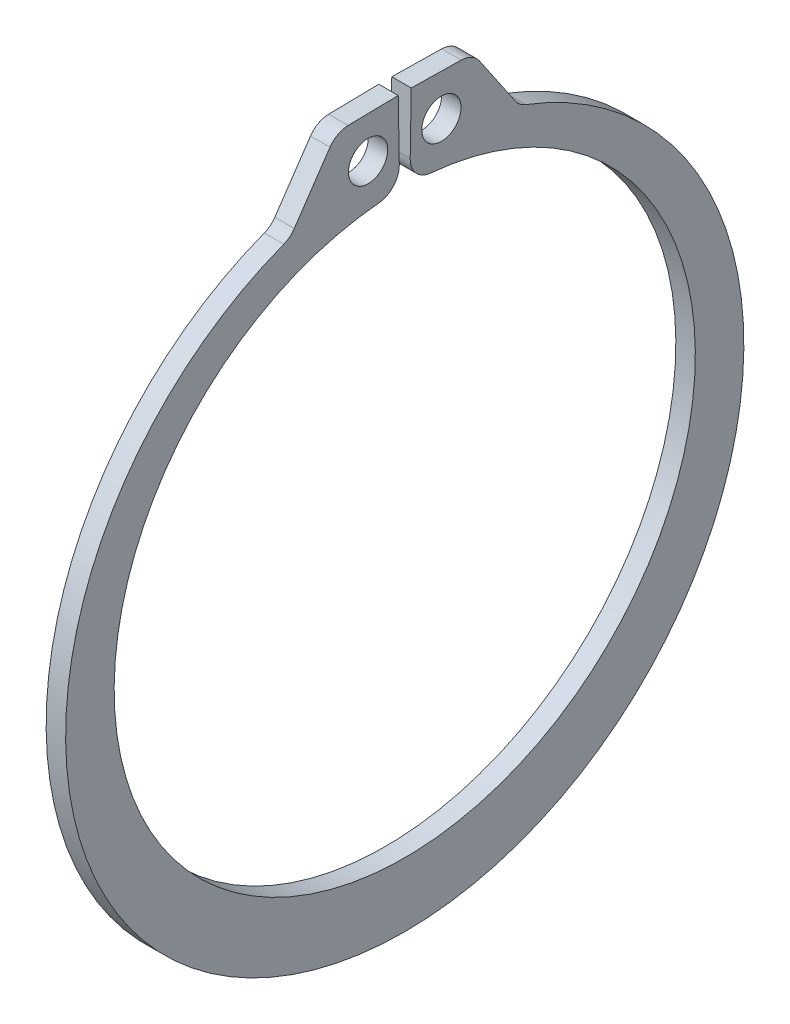
ISO-10303-21;
HEADER;
FILE_DESCRIPTION(('STEP AP214'),'2;1');
FILE_NAME('part.step','',(''),(''),'','','');
FILE_SCHEMA(('AUTOMOTIVE_DESIGN { 1 0 10303 214 1 1 1 1 }'));
ENDSEC;
DATA;
#1=APPLICATION_CONTEXT('core data for automotive mechanical design processes');
#2=APPLICATION_PROTOCOL_DEFINITION('international standard','automotive_design',2000,#1);
#3=PRODUCT_CONTEXT('',#1,'mechanical');
#4=PRODUCT('Part','Part','',(#3));
#5=PRODUCT_RELATED_PRODUCT_CATEGORY('part','',(#4));
#6=PRODUCT_DEFINITION_FORMATION('','',#4);
#7=PRODUCT_DEFINITION_CONTEXT('part definition',#1,'design');
#8=PRODUCT_DEFINITION('design','',#6,#7);
#9=PRODUCT_DEFINITION_SHAPE('','',#8);
#10=(LENGTH_UNIT() NAMED_UNIT(*) SI_UNIT(.MILLI.,.METRE.));
#11=(NAMED_UNIT(*) PLANE_ANGLE_UNIT() SI_UNIT($,.RADIAN.));
#12=(NAMED_UNIT(*) SI_UNIT($,.STERADIAN.) SOLID_ANGLE_UNIT());
#13=UNCERTAINTY_MEASURE_WITH_UNIT(LENGTH_MEASURE(1.E-05),#10,'distance_accuracy_value','');
#14=(GEOMETRIC_REPRESENTATION_CONTEXT(3) GLOBAL_UNCERTAINTY_ASSIGNED_CONTEXT((#13)) GLOBAL_UNIT_ASSIGNED_CONTEXT((#10,
#11,#12)) REPRESENTATION_CONTEXT('',''));
#15=CARTESIAN_POINT('',(0.,0.,0.));
#16=DIRECTION('',(0.,0.,1.));
#17=DIRECTION('',(1.,0.,0.));
#18=AXIS2_PLACEMENT_3D('',#15,#16,#17);
#19=CARTESIAN_POINT('',(0.7874,-1.25782092988819,0.));
#20=DIRECTION('',(1.,0.,0.));
#21=DIRECTION('',(0.,0.,-1.));
#22=AXIS2_PLACEMENT_3D('',#19,#20,#21);
#23=PLANE('',#22);
#24=CARTESIAN_POINT('',(0.7874,26.7747614656782,2.96328534207093));
#25=DIRECTION('',(1.,0.,0.));
#26=DIRECTION('',(0.,0.,-1.));
#27=AXIS2_PLACEMENT_3D('',#24,#25,#26);
#28=CIRCLE('',#27,1.5875);
#29=CARTESIAN_POINT('',(0.7874,26.7747614656782,1.37578534207093));
#30=VERTEX_POINT('',#29);
#31=EDGE_CURVE('E178',#30,#30,#28,.T.);
#32=ORIENTED_EDGE('',*,*,#31,.F.);
#33=EDGE_LOOP('',(#32));
#34=FACE_BOUND('',#33,.T.);
#35=DIRECTION('',(0.,0.827378750323037,0.561644374594716));
#36=VECTOR('',#35,1.);
#37=CARTESIAN_POINT('',(0.7874,30.058101333657,-5.51652639489787));
#38=LINE('',#37,#36);
#39=CARTESIAN_POINT('',(0.7874,25.0331530848591,-8.92758078258311));
#40=VERTEX_POINT('',#39);
#41=CARTESIAN_POINT('',(0.7874,29.2787202455527,-6.0455888147732));
#42=VERTEX_POINT('',#41);
#43=EDGE_CURVE('E184',#40,#42,#38,.T.);
#44=ORIENTED_EDGE('',*,*,#43,.T.);
#45=CARTESIAN_POINT('',(0.7874,28.2587178968512,-4.54298626631154));
#46=DIRECTION('',(1.,0.,0.));
#47=DIRECTION('',(0.,0.,-1.));
#48=AXIS2_PLACEMENT_3D('',#45,#46,#47);
#49=CIRCLE('',#48,1.8161);
#50=CARTESIAN_POINT('',(0.7874,30.0745412960247,-4.57468158164229));
#51=VERTEX_POINT('',#50);
#52=EDGE_CURVE('E223',#42,#51,#49,.T.);
#53=ORIENTED_EDGE('',*,*,#52,.T.);
#54=DIRECTION('',(0.,0.0174524064372831,0.999847695156391));
#55=VECTOR('',#54,1.);
#56=CARTESIAN_POINT('',(0.7874,30.1452080394262,-0.52618656360281));
#57=LINE('',#56,#55);
#58=CARTESIAN_POINT('',(0.7874,30.1452080394262,-0.52618656360281));
#59=VERTEX_POINT('',#58);
#60=EDGE_CURVE('E187',#51,#59,#57,.T.);
#61=ORIENTED_EDGE('',*,*,#60,.T.);
#62=DIRECTION('',(0.,-0.999847695156391,0.0174524064372839));
#63=VECTOR('',#62,1.);
#64=CARTESIAN_POINT('',(0.7874,23.4914215976994,-0.410044289243973));
#65=LINE('',#64,#63);
#66=CARTESIAN_POINT('',(0.7874,25.2420172473351,-0.44060104997142));
#67=VERTEX_POINT('',#66);
#68=EDGE_CURVE('E155',#59,#67,#65,.T.);
#69=ORIENTED_EDGE('',*,*,#68,.T.);
#70=CARTESIAN_POINT('',(0.7874,25.2103219320044,-2.25642444914494));
#71=DIRECTION('',(1.,0.,0.));
#72=DIRECTION('',(0.,0.,-1.));
#73=AXIS2_PLACEMENT_3D('',#70,#71,#72);
#74=CIRCLE('',#73,1.8161);
#75=CARTESIAN_POINT('',(0.7874,23.4014528721566,-2.09452344752541));
#76=VERTEX_POINT('',#75);
#77=EDGE_CURVE('E221',#67,#76,#74,.T.);
#78=ORIENTED_EDGE('',*,*,#77,.T.);
#79=CARTESIAN_POINT('',(0.7874,0.,0.));
#80=DIRECTION('',(-1.,0.,0.));
#81=DIRECTION('',(0.,0.,-1.));
#82=AXIS2_PLACEMENT_3D('',#79,#80,#81);
#83=CIRCLE('',#82,23.495);
#84=CARTESIAN_POINT('',(0.7874,23.4014528721566,2.09452344752541));
#85=VERTEX_POINT('',#84);
#86=EDGE_CURVE('E190',#76,#85,#83,.T.);
#87=ORIENTED_EDGE('',*,*,#86,.T.);
#88=CARTESIAN_POINT('',(0.7874,25.2103219320044,2.25642444914495));
#89=DIRECTION('',(1.,0.,0.));
#90=DIRECTION('',(0.,0.,-1.));
#91=AXIS2_PLACEMENT_3D('',#88,#89,#90);
#92=CIRCLE('',#91,1.8161);
#93=CARTESIAN_POINT('',(0.7874,25.2420172473351,0.440601049971422));
#94=VERTEX_POINT('',#93);
#95=EDGE_CURVE('E219',#85,#94,#92,.T.);
#96=ORIENTED_EDGE('',*,*,#95,.T.);
#97=DIRECTION('',(0.,0.999847695156391,0.0174524064372836));
#98=VECTOR('',#97,1.);
#99=CARTESIAN_POINT('',(0.7874,23.4914215976994,0.410044289243975));
#100=LINE('',#99,#98);
#101=CARTESIAN_POINT('',(0.7874,30.1452080394262,0.52618656360281));
#102=VERTEX_POINT('',#101);
#103=EDGE_CURVE('E193',#94,#102,#100,.T.);
#104=ORIENTED_EDGE('',*,*,#103,.T.);
#105=DIRECTION('',(0.,-0.0174524064372831,0.999847695156391));
#106=VECTOR('',#105,1.);
#107=CARTESIAN_POINT('',(0.7874,30.1452080394262,0.52618656360281));
#108=LINE('',#107,#106);
#109=CARTESIAN_POINT('',(0.7874,30.0745412960247,4.57468158164229));
#110=VERTEX_POINT('',#109);
#111=EDGE_CURVE('E195',#102,#110,#108,.T.);
#112=ORIENTED_EDGE('',*,*,#111,.T.);
#113=CARTESIAN_POINT('',(0.7874,28.2587178968512,4.54298626631154));
#114=DIRECTION('',(1.,0.,0.));
#115=DIRECTION('',(0.,0.,-1.));
#116=AXIS2_PLACEMENT_3D('',#113,#114,#115);
#117=CIRCLE('',#116,1.8161);
#118=CARTESIAN_POINT('',(0.7874,29.2787202455527,6.0455888147732));
#119=VERTEX_POINT('',#118);
#120=EDGE_CURVE('E56',#110,#119,#117,.T.);
#121=ORIENTED_EDGE('',*,*,#120,.T.);
#122=DIRECTION('',(0.,-0.827378750323037,0.561644374594716));
#123=VECTOR('',#122,1.);
#124=CARTESIAN_POINT('',(0.7874,30.058101333657,5.51652639489787));
#125=LINE('',#124,#123);
#126=CARTESIAN_POINT('',(0.7874,25.0331530848591,8.92758078258311));
#127=VERTEX_POINT('',#126);
#128=EDGE_CURVE('E197',#119,#127,#125,.T.);
#129=ORIENTED_EDGE('',*,*,#128,.T.);
#130=CARTESIAN_POINT('',(0.7874,26.0531554335606,10.4301833310448));
#131=DIRECTION('',(1.,0.,0.));
#132=DIRECTION('',(0.,0.,-1.));
#133=AXIS2_PLACEMENT_3D('',#130,#131,#132);
#134=CIRCLE('',#133,1.8161);
#135=CARTESIAN_POINT('',(0.7874,24.3565701986872,9.78224988476362));
#136=VERTEX_POINT('',#135);
#137=EDGE_CURVE('E11',#127,#136,#134,.F.);
#138=ORIENTED_EDGE('',*,*,#137,.T.);
#139=CARTESIAN_POINT('',(0.7874,-1.25782092988819,0.));
#140=DIRECTION('',(1.,0.,0.));
#141=DIRECTION('',(0.,0.,-1.));
#142=AXIS2_PLACEMENT_3D('',#139,#140,#141);
#143=CIRCLE('',#142,27.4187790701118);
#144=CARTESIAN_POINT('',(0.7874,24.3565701986872,-9.78224988476362));
#145=VERTEX_POINT('',#144);
#146=EDGE_CURVE('E181',#136,#145,#143,.T.);
#147=ORIENTED_EDGE('',*,*,#146,.T.);
#148=CARTESIAN_POINT('',(0.7874,26.0531554335606,-10.4301833310448));
#149=DIRECTION('',(1.,0.,0.));
#150=DIRECTION('',(0.,0.,-1.));
#151=AXIS2_PLACEMENT_3D('',#148,#149,#150);
#152=CIRCLE('',#151,1.8161);
#153=EDGE_CURVE('E243',#145,#40,#152,.F.);
#154=ORIENTED_EDGE('',*,*,#153,.T.);
#155=EDGE_LOOP('',(#44,#53,#61,#69,#78,#87,#96,#104,#112,#121,#129,#138,#147,#154));
#156=FACE_BOUND('',#155,.T.);
#157=CARTESIAN_POINT('',(0.7874,26.7747614656782,-2.96328534207093));
#158=DIRECTION('',(1.,0.,0.));
#159=DIRECTION('',(0.,0.,-1.));
#160=AXIS2_PLACEMENT_3D('',#157,#158,#159);
#161=CIRCLE('',#160,1.5875);
#162=CARTESIAN_POINT('',(0.7874,26.7747614656782,-4.55078534207093));
#163=VERTEX_POINT('',#162);
#164=EDGE_CURVE('E175',#163,#163,#161,.T.);
#165=ORIENTED_EDGE('',*,*,#164,.F.);
#166=EDGE_LOOP('',(#165));
#167=FACE_BOUND('',#166,.T.);
#168=ADVANCED_FACE('F34',(#34,#156,#167),#23,.T.);
#169=CARTESIAN_POINT('',(0.7874,-1.25782092988819,0.));
#170=DIRECTION('',(-1.,0.,0.));
#171=DIRECTION('',(0.,0.,1.));
#172=AXIS2_PLACEMENT_3D('',#169,#170,#171);
#173=CYLINDRICAL_SURFACE('',#172,27.4187790701118);
#174=CARTESIAN_POINT('',(-0.7874,-1.25782092988819,0.));
#175=DIRECTION('',(1.,0.,0.));
#176=DIRECTION('',(0.,0.,-1.));
#177=AXIS2_PLACEMENT_3D('',#174,#175,#176);
#178=CIRCLE('',#177,27.4187790701118);
#179=CARTESIAN_POINT('',(-0.7874,24.3565701986872,9.78224988476362));
#180=VERTEX_POINT('',#179);
#181=CARTESIAN_POINT('',(-0.7874,24.3565701986872,-9.78224988476362));
#182=VERTEX_POINT('',#181);
#183=EDGE_CURVE('E247',#180,#182,#178,.T.);
#184=ORIENTED_EDGE('',*,*,#183,.T.);
#185=DIRECTION('',(-1.,0.,0.));
#186=VECTOR('',#185,1.);
#187=CARTESIAN_POINT('',(0.7874,24.3565701986872,-9.78224988476362));
#188=LINE('',#187,#186);
#189=EDGE_CURVE('E208',#182,#145,#188,.F.);
#190=ORIENTED_EDGE('',*,*,#189,.T.);
#191=ORIENTED_EDGE('',*,*,#146,.F.);
#192=DIRECTION('',(-1.,0.,0.));
#193=VECTOR('',#192,1.);
#194=CARTESIAN_POINT('',(0.7874,24.3565701986872,9.78224988476363));
#195=LINE('',#194,#193);
#196=EDGE_CURVE('E205',#136,#180,#195,.T.);
#197=ORIENTED_EDGE('',*,*,#196,.T.);
#198=EDGE_LOOP('',(#184,#190,#191,#197));
#199=FACE_BOUND('',#198,.T.);
#200=ADVANCED_FACE('F257',(#199),#173,.T.);
#201=CARTESIAN_POINT('',(0.7874,30.058101333657,-5.51652639489787));
#202=DIRECTION('',(0.,-0.561644374594716,0.827378750323037));
#203=DIRECTION('',(0.,-0.827378750323037,-0.561644374594716));
#204=AXIS2_PLACEMENT_3D('',#201,#202,#203);
#205=PLANE('',#204);
#206=ORIENTED_EDGE('',*,*,#43,.F.);
#207=DIRECTION('',(1.,0.,0.));
#208=VECTOR('',#207,1.);
#209=CARTESIAN_POINT('',(-0.7874,25.0331530848591,-8.92758078258311));
#210=LINE('',#209,#208);
#211=CARTESIAN_POINT('',(-0.7874,25.0331530848591,-8.92758078258311));
#212=VERTEX_POINT('',#211);
#213=EDGE_CURVE('E202',#40,#212,#210,.F.);
#214=ORIENTED_EDGE('',*,*,#213,.T.);
#215=DIRECTION('',(0.,0.827378750323037,0.561644374594716));
#216=VECTOR('',#215,1.);
#217=CARTESIAN_POINT('',(-0.7874,30.058101333657,-5.51652639489787));
#218=LINE('',#217,#216);
#219=CARTESIAN_POINT('',(-0.7874,29.2787202455527,-6.0455888147732));
#220=VERTEX_POINT('',#219);
#221=EDGE_CURVE('E148',#212,#220,#218,.T.);
#222=ORIENTED_EDGE('',*,*,#221,.T.);
#223=DIRECTION('',(-1.,0.,0.));
#224=VECTOR('',#223,1.);
#225=CARTESIAN_POINT('',(0.7874,29.2787202455527,-6.0455888147732));
#226=LINE('',#225,#224);
#227=EDGE_CURVE('E156',#220,#42,#226,.F.);
#228=ORIENTED_EDGE('',*,*,#227,.T.);
#229=EDGE_LOOP('',(#206,#214,#222,#228));
#230=FACE_BOUND('',#229,.T.);
#231=ADVANCED_FACE('F265',(#230),#205,.F.);
#232=CARTESIAN_POINT('',(0.7874,30.1452080394262,-0.52618656360281));
#233=DIRECTION('',(0.,-0.999847695156391,0.0174524064372831));
#234=DIRECTION('',(0.,-0.0174524064372831,-0.999847695156391));
#235=AXIS2_PLACEMENT_3D('',#232,#233,#234);
#236=PLANE('',#235);
#237=ORIENTED_EDGE('',*,*,#60,.F.);
#238=DIRECTION('',(-1.,0.,0.));
#239=VECTOR('',#238,1.);
#240=CARTESIAN_POINT('',(0.7874,30.0745412960247,-4.57468158164229));
#241=LINE('',#240,#239);
#242=CARTESIAN_POINT('',(-0.7874,30.0745412960247,-4.57468158164229));
#243=VERTEX_POINT('',#242);
#244=EDGE_CURVE('E144',#51,#243,#241,.T.);
#245=ORIENTED_EDGE('',*,*,#244,.T.);
#246=DIRECTION('',(0.,0.0174524064372831,0.999847695156391));
#247=VECTOR('',#246,1.);
#248=CARTESIAN_POINT('',(-0.7874,30.1452080394262,-0.52618656360281));
#249=LINE('',#248,#247);
#250=CARTESIAN_POINT('',(-0.7874,30.1452080394262,-0.52618656360281));
#251=VERTEX_POINT('',#250);
#252=EDGE_CURVE('E137',#243,#251,#249,.T.);
#253=ORIENTED_EDGE('',*,*,#252,.T.);
#254=DIRECTION('',(-1.,0.,0.));
#255=VECTOR('',#254,1.);
#256=CARTESIAN_POINT('',(0.7874,30.1452080394262,-0.52618656360281));
#257=LINE('',#256,#255);
#258=EDGE_CURVE('E141',#59,#251,#257,.T.);
#259=ORIENTED_EDGE('',*,*,#258,.F.);
#260=EDGE_LOOP('',(#237,#245,#253,#259));
#261=FACE_BOUND('',#260,.T.);
#262=ADVANCED_FACE('F140',(#261),#236,.F.);
#263=CARTESIAN_POINT('',(0.7874,23.4914215976994,-0.410044289243973));
#264=DIRECTION('',(0.,-0.0174524064372839,-0.999847695156391));
#265=DIRECTION('',(0.,0.999847695156391,-0.0174524064372839));
#266=AXIS2_PLACEMENT_3D('',#263,#264,#265);
#267=PLANE('',#266);
#268=DIRECTION('',(0.,-0.999847695156391,0.0174524064372839));
#269=VECTOR('',#268,1.);
#270=CARTESIAN_POINT('',(-0.7874,23.4914215976994,-0.410044289243973));
#271=LINE('',#270,#269);
#272=CARTESIAN_POINT('',(-0.7874,25.2420172473351,-0.44060104997142));
#273=VERTEX_POINT('',#272);
#274=EDGE_CURVE('E147',#251,#273,#271,.T.);
#275=ORIENTED_EDGE('',*,*,#274,.T.);
#276=DIRECTION('',(-1.,0.,0.));
#277=VECTOR('',#276,1.);
#278=CARTESIAN_POINT('',(0.7874,25.2420172473351,-0.44060104997142));
#279=LINE('',#278,#277);
#280=EDGE_CURVE('E230',#273,#67,#279,.F.);
#281=ORIENTED_EDGE('',*,*,#280,.T.);
#282=ORIENTED_EDGE('',*,*,#68,.F.);
#283=ORIENTED_EDGE('',*,*,#258,.T.);
#284=EDGE_LOOP('',(#275,#281,#282,#283));
#285=FACE_BOUND('',#284,.T.);
#286=ADVANCED_FACE('F152',(#285),#267,.F.);
#287=CARTESIAN_POINT('',(0.7874,0.,0.));
#288=DIRECTION('',(-1.,0.,0.));
#289=DIRECTION('',(0.,0.,1.));
#290=AXIS2_PLACEMENT_3D('',#287,#288,#289);
#291=CYLINDRICAL_SURFACE('',#290,23.495);
#292=ORIENTED_EDGE('',*,*,#86,.F.);
#293=DIRECTION('',(-1.,0.,0.));
#294=VECTOR('',#293,1.);
#295=CARTESIAN_POINT('',(0.7874,23.4014528721566,-2.09452344752541));
#296=LINE('',#295,#294);
#297=CARTESIAN_POINT('',(-0.7874,23.4014528721566,-2.09452344752541));
#298=VERTEX_POINT('',#297);
#299=EDGE_CURVE('E227',#76,#298,#296,.T.);
#300=ORIENTED_EDGE('',*,*,#299,.T.);
#301=CARTESIAN_POINT('',(-0.7874,0.,0.));
#302=DIRECTION('',(-1.,0.,0.));
#303=DIRECTION('',(0.,0.,-1.));
#304=AXIS2_PLACEMENT_3D('',#301,#302,#303);
#305=CIRCLE('',#304,23.495);
#306=CARTESIAN_POINT('',(-0.7874,23.4014528721566,2.09452344752541));
#307=VERTEX_POINT('',#306);
#308=EDGE_CURVE('E162',#298,#307,#305,.T.);
#309=ORIENTED_EDGE('',*,*,#308,.T.);
#310=DIRECTION('',(-1.,0.,0.));
#311=VECTOR('',#310,1.);
#312=CARTESIAN_POINT('',(0.7874,23.4014528721566,2.09452344752541));
#313=LINE('',#312,#311);
#314=EDGE_CURVE('E225',#307,#85,#313,.F.);
#315=ORIENTED_EDGE('',*,*,#314,.T.);
#316=EDGE_LOOP('',(#292,#300,#309,#315));
#317=FACE_BOUND('',#316,.T.);
#318=ADVANCED_FACE('F277',(#317),#291,.F.);
#319=CARTESIAN_POINT('',(0.7874,23.4914215976994,0.410044289243975));
#320=DIRECTION('',(0.,-0.0174524064372836,0.999847695156391));
#321=DIRECTION('',(0.,-0.999847695156391,-0.0174524064372836));
#322=AXIS2_PLACEMENT_3D('',#319,#320,#321);
#323=PLANE('',#322);
#324=ORIENTED_EDGE('',*,*,#103,.F.);
#325=DIRECTION('',(-1.,0.,0.));
#326=VECTOR('',#325,1.);
#327=CARTESIAN_POINT('',(0.7874,25.2420172473351,0.440601049971422));
#328=LINE('',#327,#326);
#329=CARTESIAN_POINT('',(-0.7874,25.2420172473351,0.440601049971422));
#330=VERTEX_POINT('',#329);
#331=EDGE_CURVE('E232',#94,#330,#328,.T.);
#332=ORIENTED_EDGE('',*,*,#331,.T.);
#333=DIRECTION('',(0.,0.999847695156391,0.0174524064372836));
#334=VECTOR('',#333,1.);
#335=CARTESIAN_POINT('',(-0.7874,23.4914215976994,0.410044289243975));
#336=LINE('',#335,#334);
#337=CARTESIAN_POINT('',(-0.7874,30.1452080394262,0.52618656360281));
#338=VERTEX_POINT('',#337);
#339=EDGE_CURVE('E165',#330,#338,#336,.T.);
#340=ORIENTED_EDGE('',*,*,#339,.T.);
#341=DIRECTION('',(-1.,0.,0.));
#342=VECTOR('',#341,1.);
#343=CARTESIAN_POINT('',(0.7874,30.1452080394262,0.52618656360281));
#344=LINE('',#343,#342);
#345=EDGE_CURVE('E157',#102,#338,#344,.T.);
#346=ORIENTED_EDGE('',*,*,#345,.F.);
#347=EDGE_LOOP('',(#324,#332,#340,#346));
#348=FACE_BOUND('',#347,.T.);
#349=ADVANCED_FACE('F287',(#348),#323,.F.);
#350=CARTESIAN_POINT('',(0.7874,30.1452080394262,0.52618656360281));
#351=DIRECTION('',(0.,-0.999847695156391,-0.0174524064372831));
#352=DIRECTION('',(0.,0.0174524064372831,-0.999847695156391));
#353=AXIS2_PLACEMENT_3D('',#350,#351,#352);
#354=PLANE('',#353);
#355=DIRECTION('',(0.,-0.0174524064372831,0.999847695156391));
#356=VECTOR('',#355,1.);
#357=CARTESIAN_POINT('',(-0.7874,30.1452080394262,0.52618656360281));
#358=LINE('',#357,#356);
#359=CARTESIAN_POINT('',(-0.7874,30.0745412960247,4.57468158164229));
#360=VERTEX_POINT('',#359);
#361=EDGE_CURVE('E170',#338,#360,#358,.T.);
#362=ORIENTED_EDGE('',*,*,#361,.T.);
#363=DIRECTION('',(-1.,0.,0.));
#364=VECTOR('',#363,1.);
#365=CARTESIAN_POINT('',(0.7874,30.0745412960247,4.57468158164229));
#366=LINE('',#365,#364);
#367=EDGE_CURVE('E239',#360,#110,#366,.F.);
#368=ORIENTED_EDGE('',*,*,#367,.T.);
#369=ORIENTED_EDGE('',*,*,#111,.F.);
#370=ORIENTED_EDGE('',*,*,#345,.T.);
#371=EDGE_LOOP('',(#362,#368,#369,#370));
#372=FACE_BOUND('',#371,.T.);
#373=ADVANCED_FACE('F294',(#372),#354,.F.);
#374=CARTESIAN_POINT('',(0.7874,30.058101333657,5.51652639489787));
#375=DIRECTION('',(0.,-0.561644374594716,-0.827378750323037));
#376=DIRECTION('',(0.,0.827378750323037,-0.561644374594716));
#377=AXIS2_PLACEMENT_3D('',#374,#375,#376);
#378=PLANE('',#377);
#379=ORIENTED_EDGE('',*,*,#128,.F.);
#380=DIRECTION('',(-1.,0.,0.));
#381=VECTOR('',#380,1.);
#382=CARTESIAN_POINT('',(0.7874,29.2787202455527,6.0455888147732));
#383=LINE('',#382,#381);
#384=CARTESIAN_POINT('',(-0.7874,29.2787202455527,6.0455888147732));
#385=VERTEX_POINT('',#384);
#386=EDGE_CURVE('E236',#119,#385,#383,.T.);
#387=ORIENTED_EDGE('',*,*,#386,.T.);
#388=DIRECTION('',(0.,-0.827378750323037,0.561644374594716));
#389=VECTOR('',#388,1.);
#390=CARTESIAN_POINT('',(-0.7874,30.058101333657,5.51652639489787));
#391=LINE('',#390,#389);
#392=CARTESIAN_POINT('',(-0.7874,25.0331530848591,8.92758078258311));
#393=VERTEX_POINT('',#392);
#394=EDGE_CURVE('E173',#385,#393,#391,.T.);
#395=ORIENTED_EDGE('',*,*,#394,.T.);
#396=DIRECTION('',(1.,0.,0.));
#397=VECTOR('',#396,1.);
#398=CARTESIAN_POINT('',(0.7874,25.0331530848591,8.92758078258311));
#399=LINE('',#398,#397);
#400=EDGE_CURVE('E49',#393,#127,#399,.T.);
#401=ORIENTED_EDGE('',*,*,#400,.T.);
#402=EDGE_LOOP('',(#379,#387,#395,#401));
#403=FACE_BOUND('',#402,.T.);
#404=ADVANCED_FACE('F250',(#403),#378,.F.);
#405=CARTESIAN_POINT('',(0.7874,26.7747614656782,2.96328534207093));
#406=DIRECTION('',(-1.,0.,0.));
#407=DIRECTION('',(0.,0.,1.));
#408=AXIS2_PLACEMENT_3D('',#405,#406,#407);
#409=CYLINDRICAL_SURFACE('',#408,1.5875);
#410=ORIENTED_EDGE('',*,*,#31,.T.);
#411=EDGE_LOOP('',(#410));
#412=FACE_BOUND('',#411,.T.);
#413=CARTESIAN_POINT('',(-0.7874,26.7747614656782,2.96328534207093));
#414=DIRECTION('',(1.,0.,0.));
#415=DIRECTION('',(0.,0.,-1.));
#416=AXIS2_PLACEMENT_3D('',#413,#414,#415);
#417=CIRCLE('',#416,1.5875);
#418=CARTESIAN_POINT('',(-0.7874,26.7747614656782,1.37578534207093));
#419=VERTEX_POINT('',#418);
#420=EDGE_CURVE('E332',#419,#419,#417,.T.);
#421=ORIENTED_EDGE('',*,*,#420,.F.);
#422=EDGE_LOOP('',(#421));
#423=FACE_BOUND('',#422,.T.);
#424=ADVANCED_FACE('F301',(#412,#423),#409,.F.);
#425=CARTESIAN_POINT('',(0.7874,26.7747614656782,-2.96328534207093));
#426=DIRECTION('',(-1.,0.,0.));
#427=DIRECTION('',(0.,0.,1.));
#428=AXIS2_PLACEMENT_3D('',#425,#426,#427);
#429=CYLINDRICAL_SURFACE('',#428,1.5875);
#430=ORIENTED_EDGE('',*,*,#164,.T.);
#431=EDGE_LOOP('',(#430));
#432=FACE_BOUND('',#431,.T.);
#433=CARTESIAN_POINT('',(-0.7874,26.7747614656782,-2.96328534207093));
#434=DIRECTION('',(1.,0.,0.));
#435=DIRECTION('',(0.,0.,-1.));
#436=AXIS2_PLACEMENT_3D('',#433,#434,#435);
#437=CIRCLE('',#436,1.5875);
#438=CARTESIAN_POINT('',(-0.7874,26.7747614656782,-4.55078534207093));
#439=VERTEX_POINT('',#438);
#440=EDGE_CURVE('E329',#439,#439,#437,.T.);
#441=ORIENTED_EDGE('',*,*,#440,.F.);
#442=EDGE_LOOP('',(#441));
#443=FACE_BOUND('',#442,.T.);
#444=ADVANCED_FACE('F315',(#432,#443),#429,.F.);
#445=CARTESIAN_POINT('',(-0.7874,-1.25782092988819,0.));
#446=DIRECTION('',(1.,0.,0.));
#447=DIRECTION('',(0.,0.,-1.));
#448=AXIS2_PLACEMENT_3D('',#445,#446,#447);
#449=PLANE('',#448);
#450=ORIENTED_EDGE('',*,*,#440,.T.);
#451=EDGE_LOOP('',(#450));
#452=FACE_BOUND('',#451,.T.);
#453=ORIENTED_EDGE('',*,*,#420,.T.);
#454=EDGE_LOOP('',(#453));
#455=FACE_BOUND('',#454,.T.);
#456=ORIENTED_EDGE('',*,*,#252,.F.);
#457=CARTESIAN_POINT('',(-0.7874,28.2587178968512,-4.54298626631154));
#458=DIRECTION('',(1.,0.,0.));
#459=DIRECTION('',(0.,0.,-1.));
#460=AXIS2_PLACEMENT_3D('',#457,#458,#459);
#461=CIRCLE('',#460,1.8161);
#462=EDGE_CURVE('E216',#243,#220,#461,.F.);
#463=ORIENTED_EDGE('',*,*,#462,.T.);
#464=ORIENTED_EDGE('',*,*,#221,.F.);
#465=CARTESIAN_POINT('',(-0.7874,26.0531554335606,-10.4301833310448));
#466=DIRECTION('',(1.,0.,0.));
#467=DIRECTION('',(0.,0.,-1.));
#468=AXIS2_PLACEMENT_3D('',#465,#466,#467);
#469=CIRCLE('',#468,1.8161);
#470=EDGE_CURVE('E241',#212,#182,#469,.T.);
#471=ORIENTED_EDGE('',*,*,#470,.T.);
#472=ORIENTED_EDGE('',*,*,#183,.F.);
#473=CARTESIAN_POINT('',(-0.7874,26.0531554335606,10.4301833310448));
#474=DIRECTION('',(1.,0.,0.));
#475=DIRECTION('',(0.,0.,-1.));
#476=AXIS2_PLACEMENT_3D('',#473,#474,#475);
#477=CIRCLE('',#476,1.8161);
#478=EDGE_CURVE('E42',#180,#393,#477,.T.);
#479=ORIENTED_EDGE('',*,*,#478,.T.);
#480=ORIENTED_EDGE('',*,*,#394,.F.);
#481=CARTESIAN_POINT('',(-0.7874,28.2587178968512,4.54298626631154));
#482=DIRECTION('',(1.,0.,0.));
#483=DIRECTION('',(0.,0.,-1.));
#484=AXIS2_PLACEMENT_3D('',#481,#482,#483);
#485=CIRCLE('',#484,1.8161);
#486=EDGE_CURVE('E211',#385,#360,#485,.F.);
#487=ORIENTED_EDGE('',*,*,#486,.T.);
#488=ORIENTED_EDGE('',*,*,#361,.F.);
#489=ORIENTED_EDGE('',*,*,#339,.F.);
#490=CARTESIAN_POINT('',(-0.7874,25.2103219320044,2.25642444914495));
#491=DIRECTION('',(1.,0.,0.));
#492=DIRECTION('',(0.,0.,-1.));
#493=AXIS2_PLACEMENT_3D('',#490,#491,#492);
#494=CIRCLE('',#493,1.8161);
#495=EDGE_CURVE('E213',#330,#307,#494,.F.);
#496=ORIENTED_EDGE('',*,*,#495,.T.);
#497=ORIENTED_EDGE('',*,*,#308,.F.);
#498=CARTESIAN_POINT('',(-0.7874,25.2103219320044,-2.25642444914494));
#499=DIRECTION('',(1.,0.,0.));
#500=DIRECTION('',(0.,0.,-1.));
#501=AXIS2_PLACEMENT_3D('',#498,#499,#500);
#502=CIRCLE('',#501,1.8161);
#503=EDGE_CURVE('E161',#298,#273,#502,.F.);
#504=ORIENTED_EDGE('',*,*,#503,.T.);
#505=ORIENTED_EDGE('',*,*,#274,.F.);
#506=EDGE_LOOP('',(#456,#463,#464,#471,#472,#479,#480,#487,#488,#489,#496,#497,#504,#505));
#507=FACE_BOUND('',#506,.T.);
#508=ADVANCED_FACE('F159',(#452,#455,#507),#449,.F.);
#509=CARTESIAN_POINT('',(0.7874,26.0531554335606,-10.4301833310448));
#510=DIRECTION('',(-1.,0.,0.));
#511=DIRECTION('',(0.,0.,1.));
#512=AXIS2_PLACEMENT_3D('',#509,#510,#511);
#513=CYLINDRICAL_SURFACE('',#512,1.8161);
#514=ORIENTED_EDGE('',*,*,#153,.F.);
#515=ORIENTED_EDGE('',*,*,#189,.F.);
#516=ORIENTED_EDGE('',*,*,#470,.F.);
#517=ORIENTED_EDGE('',*,*,#213,.F.);
#518=EDGE_LOOP('',(#514,#515,#516,#517));
#519=FACE_BOUND('',#518,.T.);
#520=ADVANCED_FACE('F260',(#519),#513,.F.);
#521=CARTESIAN_POINT('',(0.7874,28.2587178968512,-4.54298626631154));
#522=DIRECTION('',(-1.,0.,0.));
#523=DIRECTION('',(0.,0.,1.));
#524=AXIS2_PLACEMENT_3D('',#521,#522,#523);
#525=CYLINDRICAL_SURFACE('',#524,1.8161);
#526=ORIENTED_EDGE('',*,*,#52,.F.);
#527=ORIENTED_EDGE('',*,*,#227,.F.);
#528=ORIENTED_EDGE('',*,*,#462,.F.);
#529=ORIENTED_EDGE('',*,*,#244,.F.);
#530=EDGE_LOOP('',(#526,#527,#528,#529));
#531=FACE_BOUND('',#530,.T.);
#532=ADVANCED_FACE('F270',(#531),#525,.T.);
#533=CARTESIAN_POINT('',(0.7874,25.2103219320044,-2.25642444914494));
#534=DIRECTION('',(-1.,0.,0.));
#535=DIRECTION('',(0.,0.,1.));
#536=AXIS2_PLACEMENT_3D('',#533,#534,#535);
#537=CYLINDRICAL_SURFACE('',#536,1.8161);
#538=ORIENTED_EDGE('',*,*,#77,.F.);
#539=ORIENTED_EDGE('',*,*,#280,.F.);
#540=ORIENTED_EDGE('',*,*,#503,.F.);
#541=ORIENTED_EDGE('',*,*,#299,.F.);
#542=EDGE_LOOP('',(#538,#539,#540,#541));
#543=FACE_BOUND('',#542,.T.);
#544=ADVANCED_FACE('F275',(#543),#537,.T.);
#545=CARTESIAN_POINT('',(0.7874,25.2103219320044,2.25642444914495));
#546=DIRECTION('',(-1.,0.,0.));
#547=DIRECTION('',(0.,0.,1.));
#548=AXIS2_PLACEMENT_3D('',#545,#546,#547);
#549=CYLINDRICAL_SURFACE('',#548,1.8161);
#550=ORIENTED_EDGE('',*,*,#95,.F.);
#551=ORIENTED_EDGE('',*,*,#314,.F.);
#552=ORIENTED_EDGE('',*,*,#495,.F.);
#553=ORIENTED_EDGE('',*,*,#331,.F.);
#554=EDGE_LOOP('',(#550,#551,#552,#553));
#555=FACE_BOUND('',#554,.T.);
#556=ADVANCED_FACE('F284',(#555),#549,.T.);
#557=CARTESIAN_POINT('',(0.7874,28.2587178968512,4.54298626631154));
#558=DIRECTION('',(-1.,0.,0.));
#559=DIRECTION('',(0.,0.,1.));
#560=AXIS2_PLACEMENT_3D('',#557,#558,#559);
#561=CYLINDRICAL_SURFACE('',#560,1.8161);
#562=ORIENTED_EDGE('',*,*,#120,.F.);
#563=ORIENTED_EDGE('',*,*,#367,.F.);
#564=ORIENTED_EDGE('',*,*,#486,.F.);
#565=ORIENTED_EDGE('',*,*,#386,.F.);
#566=EDGE_LOOP('',(#562,#563,#564,#565));
#567=FACE_BOUND('',#566,.T.);
#568=ADVANCED_FACE('F293',(#567),#561,.T.);
#569=CARTESIAN_POINT('',(0.7874,26.0531554335606,10.4301833310448));
#570=DIRECTION('',(-1.,0.,0.));
#571=DIRECTION('',(0.,0.,1.));
#572=AXIS2_PLACEMENT_3D('',#569,#570,#571);
#573=CYLINDRICAL_SURFACE('',#572,1.8161);
#574=ORIENTED_EDGE('',*,*,#137,.F.);
#575=ORIENTED_EDGE('',*,*,#400,.F.);
#576=ORIENTED_EDGE('',*,*,#478,.F.);
#577=ORIENTED_EDGE('',*,*,#196,.F.);
#578=EDGE_LOOP('',(#574,#575,#576,#577));
#579=FACE_BOUND('',#578,.T.);
#580=ADVANCED_FACE('F36',(#579),#573,.F.);
#581=CLOSED_SHELL('',(#168,#200,#231,#262,#286,#318,#349,#373,#404,#424,#444,#508,#520,#532,
#544,#556,#568,#580));
#582=MANIFOLD_SOLID_BREP('B2',#581);
#583=ADVANCED_BREP_SHAPE_REPRESENTATION('',(#18,#582),#14);
#584=SHAPE_DEFINITION_REPRESENTATION(#9,#583);
ENDSEC;
END-ISO-10303-21;
